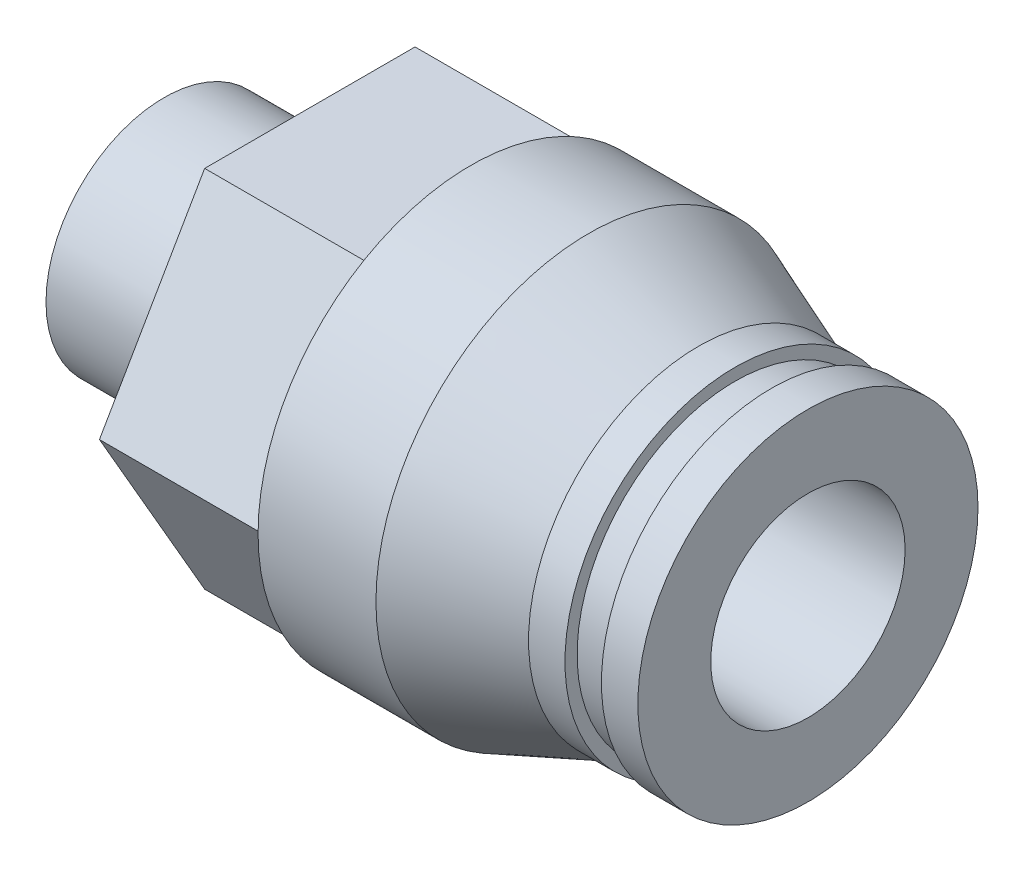
ISO-10303-21;
HEADER;
FILE_DESCRIPTION(('STEP AP214'),'2;1');
FILE_NAME('part.step','',(''),(''),'','','');
FILE_SCHEMA(('AUTOMOTIVE_DESIGN { 1 0 10303 214 1 1 1 1 }'));
ENDSEC;
DATA;
#1=APPLICATION_CONTEXT('core data for automotive mechanical design processes');
#2=APPLICATION_PROTOCOL_DEFINITION('international standard','automotive_design',2000,#1);
#3=PRODUCT_CONTEXT('',#1,'mechanical');
#4=PRODUCT('Part','Part','',(#3));
#5=PRODUCT_RELATED_PRODUCT_CATEGORY('part','',(#4));
#6=PRODUCT_DEFINITION_FORMATION('','',#4);
#7=PRODUCT_DEFINITION_CONTEXT('part definition',#1,'design');
#8=PRODUCT_DEFINITION('design','',#6,#7);
#9=PRODUCT_DEFINITION_SHAPE('','',#8);
#10=(LENGTH_UNIT() NAMED_UNIT(*) SI_UNIT(.MILLI.,.METRE.));
#11=(NAMED_UNIT(*) PLANE_ANGLE_UNIT() SI_UNIT($,.RADIAN.));
#12=(NAMED_UNIT(*) SI_UNIT($,.STERADIAN.) SOLID_ANGLE_UNIT());
#13=UNCERTAINTY_MEASURE_WITH_UNIT(LENGTH_MEASURE(1.E-05),#10,'distance_accuracy_value','');
#14=(GEOMETRIC_REPRESENTATION_CONTEXT(3) GLOBAL_UNCERTAINTY_ASSIGNED_CONTEXT((#13)) GLOBAL_UNIT_ASSIGNED_CONTEXT((#10,
#11,#12)) REPRESENTATION_CONTEXT('',''));
#15=CARTESIAN_POINT('',(0.,0.,0.));
#16=DIRECTION('',(0.,0.,1.));
#17=DIRECTION('',(1.,0.,0.));
#18=AXIS2_PLACEMENT_3D('',#15,#16,#17);
#19=CARTESIAN_POINT('',(6.,4.86,0.));
#20=DIRECTION('',(-1.,0.,0.));
#21=DIRECTION('',(0.,0.,1.));
#22=AXIS2_PLACEMENT_3D('',#19,#20,#21);
#23=PLANE('',#22);
#24=CARTESIAN_POINT('',(6.,0.,0.));
#25=DIRECTION('',(1.,0.,0.));
#26=DIRECTION('',(0.,0.,-1.));
#27=AXIS2_PLACEMENT_3D('',#24,#25,#26);
#28=CIRCLE('',#27,4.86);
#29=CARTESIAN_POINT('',(6.,0.,-4.86));
#30=VERTEX_POINT('',#29);
#31=EDGE_CURVE('E219',#30,#30,#28,.T.);
#32=ORIENTED_EDGE('',*,*,#31,.T.);
#33=EDGE_LOOP('',(#32));
#34=FACE_BOUND('',#33,.T.);
#35=DIRECTION('',(0.,-0.866025403784439,0.5));
#36=VECTOR('',#35,1.);
#37=CARTESIAN_POINT('',(6.,0.,-8.66025403784439));
#38=LINE('',#37,#36);
#39=CARTESIAN_POINT('',(6.,0.,-8.66025403784439));
#40=VERTEX_POINT('',#39);
#41=CARTESIAN_POINT('',(6.,-7.5,-4.33012701892219));
#42=VERTEX_POINT('',#41);
#43=EDGE_CURVE('E128',#40,#42,#38,.T.);
#44=ORIENTED_EDGE('',*,*,#43,.T.);
#45=DIRECTION('',(0.,0.,1.));
#46=VECTOR('',#45,1.);
#47=CARTESIAN_POINT('',(6.,-7.5,-4.33012701892219));
#48=LINE('',#47,#46);
#49=CARTESIAN_POINT('',(6.,-7.5,4.3301270189222));
#50=VERTEX_POINT('',#49);
#51=EDGE_CURVE('E111',#42,#50,#48,.T.);
#52=ORIENTED_EDGE('',*,*,#51,.T.);
#53=DIRECTION('',(0.,0.866025403784439,0.5));
#54=VECTOR('',#53,1.);
#55=CARTESIAN_POINT('',(6.,-7.5,4.3301270189222));
#56=LINE('',#55,#54);
#57=CARTESIAN_POINT('',(6.,0.,8.66025403784439));
#58=VERTEX_POINT('',#57);
#59=EDGE_CURVE('E122',#50,#58,#56,.T.);
#60=ORIENTED_EDGE('',*,*,#59,.T.);
#61=DIRECTION('',(0.,0.866025403784439,-0.5));
#62=VECTOR('',#61,1.);
#63=CARTESIAN_POINT('',(6.,0.,8.66025403784439));
#64=LINE('',#63,#62);
#65=CARTESIAN_POINT('',(6.,7.5,4.33012701892219));
#66=VERTEX_POINT('',#65);
#67=EDGE_CURVE('E31',#58,#66,#64,.T.);
#68=ORIENTED_EDGE('',*,*,#67,.T.);
#69=DIRECTION('',(0.,0.,-1.));
#70=VECTOR('',#69,1.);
#71=CARTESIAN_POINT('',(6.,7.5,4.33012701892219));
#72=LINE('',#71,#70);
#73=CARTESIAN_POINT('',(6.,7.5,-4.3301270189222));
#74=VERTEX_POINT('',#73);
#75=EDGE_CURVE('E132',#66,#74,#72,.T.);
#76=ORIENTED_EDGE('',*,*,#75,.T.);
#77=DIRECTION('',(0.,-0.866025403784439,-0.5));
#78=VECTOR('',#77,1.);
#79=CARTESIAN_POINT('',(6.,7.5,-4.3301270189222));
#80=LINE('',#79,#78);
#81=EDGE_CURVE('E135',#74,#40,#80,.T.);
#82=ORIENTED_EDGE('',*,*,#81,.T.);
#83=EDGE_LOOP('',(#44,#52,#60,#68,#76,#82));
#84=FACE_BOUND('',#83,.T.);
#85=ADVANCED_FACE('F16',(#34,#84),#23,.T.);
#86=CARTESIAN_POINT('',(0.,0.,0.));
#87=DIRECTION('',(-1.,0.,0.));
#88=DIRECTION('',(0.,0.,1.));
#89=AXIS2_PLACEMENT_3D('',#86,#87,#88);
#90=PLANE('',#89);
#91=CARTESIAN_POINT('',(0.,0.,0.));
#92=DIRECTION('',(1.,0.,0.));
#93=DIRECTION('',(0.,0.,-1.));
#94=AXIS2_PLACEMENT_3D('',#91,#92,#93);
#95=CIRCLE('',#94,4.86);
#96=CARTESIAN_POINT('',(0.,0.,-4.86));
#97=VERTEX_POINT('',#96);
#98=EDGE_CURVE('E222',#97,#97,#95,.T.);
#99=ORIENTED_EDGE('',*,*,#98,.F.);
#100=EDGE_LOOP('',(#99));
#101=FACE_BOUND('',#100,.T.);
#102=DIRECTION('',(0.,-0.866025403784439,-0.5));
#103=VECTOR('',#102,1.);
#104=CARTESIAN_POINT('',(0.,0.,2.88675134594813));
#105=LINE('',#104,#103);
#106=CARTESIAN_POINT('',(0.,0.,2.88675134594813));
#107=VERTEX_POINT('',#106);
#108=CARTESIAN_POINT('',(0.,-2.5,1.44337567297406));
#109=VERTEX_POINT('',#108);
#110=EDGE_CURVE('E177',#107,#109,#105,.T.);
#111=ORIENTED_EDGE('',*,*,#110,.T.);
#112=DIRECTION('',(0.,0.,-1.));
#113=VECTOR('',#112,1.);
#114=CARTESIAN_POINT('',(0.,-2.5,1.44337567297406));
#115=LINE('',#114,#113);
#116=CARTESIAN_POINT('',(0.,-2.5,-1.44337567297407));
#117=VERTEX_POINT('',#116);
#118=EDGE_CURVE('E39',#109,#117,#115,.T.);
#119=ORIENTED_EDGE('',*,*,#118,.T.);
#120=DIRECTION('',(0.,0.866025403784439,-0.5));
#121=VECTOR('',#120,1.);
#122=CARTESIAN_POINT('',(0.,-2.5,-1.44337567297407));
#123=LINE('',#122,#121);
#124=CARTESIAN_POINT('',(0.,0.,-2.88675134594813));
#125=VERTEX_POINT('',#124);
#126=EDGE_CURVE('E165',#117,#125,#123,.T.);
#127=ORIENTED_EDGE('',*,*,#126,.T.);
#128=DIRECTION('',(0.,0.866025403784439,0.5));
#129=VECTOR('',#128,1.);
#130=CARTESIAN_POINT('',(0.,0.,-2.88675134594813));
#131=LINE('',#130,#129);
#132=CARTESIAN_POINT('',(0.,2.5,-1.44337567297407));
#133=VERTEX_POINT('',#132);
#134=EDGE_CURVE('E168',#125,#133,#131,.T.);
#135=ORIENTED_EDGE('',*,*,#134,.T.);
#136=DIRECTION('',(0.,0.,1.));
#137=VECTOR('',#136,1.);
#138=CARTESIAN_POINT('',(0.,2.5,-1.44337567297407));
#139=LINE('',#138,#137);
#140=CARTESIAN_POINT('',(0.,2.5,1.44337567297406));
#141=VERTEX_POINT('',#140);
#142=EDGE_CURVE('E171',#133,#141,#139,.T.);
#143=ORIENTED_EDGE('',*,*,#142,.T.);
#144=DIRECTION('',(0.,-0.866025403784439,0.5));
#145=VECTOR('',#144,1.);
#146=CARTESIAN_POINT('',(0.,2.5,1.44337567297406));
#147=LINE('',#146,#145);
#148=EDGE_CURVE('E174',#141,#107,#147,.T.);
#149=ORIENTED_EDGE('',*,*,#148,.T.);
#150=EDGE_LOOP('',(#111,#119,#127,#135,#143,#149));
#151=FACE_BOUND('',#150,.T.);
#152=ADVANCED_FACE('F18',(#101,#151),#90,.T.);
#153=CARTESIAN_POINT('',(9.,4.,0.));
#154=DIRECTION('',(1.,0.,0.));
#155=DIRECTION('',(0.,0.,-1.));
#156=AXIS2_PLACEMENT_3D('',#153,#154,#155);
#157=PLANE('',#156);
#158=CARTESIAN_POINT('',(9.,0.,0.));
#159=DIRECTION('',(1.,0.,0.));
#160=DIRECTION('',(0.,0.,-1.));
#161=AXIS2_PLACEMENT_3D('',#158,#159,#160);
#162=CIRCLE('',#161,4.);
#163=CARTESIAN_POINT('',(9.,0.,-4.));
#164=VERTEX_POINT('',#163);
#165=EDGE_CURVE('E192',#164,#164,#162,.T.);
#166=ORIENTED_EDGE('',*,*,#165,.T.);
#167=EDGE_LOOP('',(#166));
#168=FACE_BOUND('',#167,.T.);
#169=DIRECTION('',(0.,-0.866025403784439,0.5));
#170=VECTOR('',#169,1.);
#171=CARTESIAN_POINT('',(9.,1.75,-3.89711431702998));
#172=LINE('',#171,#170);
#173=CARTESIAN_POINT('',(9.,0.,-2.88675134594813));
#174=VERTEX_POINT('',#173);
#175=CARTESIAN_POINT('',(9.,-2.5,-1.44337567297407));
#176=VERTEX_POINT('',#175);
#177=EDGE_CURVE('E24',#174,#176,#172,.T.);
#178=ORIENTED_EDGE('',*,*,#177,.T.);
#179=DIRECTION('',(0.,0.,1.));
#180=VECTOR('',#179,1.);
#181=CARTESIAN_POINT('',(9.,-2.5,0.));
#182=LINE('',#181,#180);
#183=CARTESIAN_POINT('',(9.,-2.5,1.44337567297406));
#184=VERTEX_POINT('',#183);
#185=EDGE_CURVE('E10',#176,#184,#182,.T.);
#186=ORIENTED_EDGE('',*,*,#185,.T.);
#187=DIRECTION('',(0.,0.866025403784439,0.5));
#188=VECTOR('',#187,1.);
#189=CARTESIAN_POINT('',(9.,1.75,3.89711431702997));
#190=LINE('',#189,#188);
#191=CARTESIAN_POINT('',(9.,0.,2.88675134594813));
#192=VERTEX_POINT('',#191);
#193=EDGE_CURVE('E225',#184,#192,#190,.T.);
#194=ORIENTED_EDGE('',*,*,#193,.T.);
#195=DIRECTION('',(0.,0.866025403784439,-0.5));
#196=VECTOR('',#195,1.);
#197=CARTESIAN_POINT('',(9.,4.25,0.433012701892217));
#198=LINE('',#197,#196);
#199=CARTESIAN_POINT('',(9.,2.5,1.44337567297406));
#200=VERTEX_POINT('',#199);
#201=EDGE_CURVE('E228',#192,#200,#198,.T.);
#202=ORIENTED_EDGE('',*,*,#201,.T.);
#203=DIRECTION('',(0.,0.,-1.));
#204=VECTOR('',#203,1.);
#205=CARTESIAN_POINT('',(9.,2.5,0.));
#206=LINE('',#205,#204);
#207=CARTESIAN_POINT('',(9.,2.5,-1.44337567297407));
#208=VERTEX_POINT('',#207);
#209=EDGE_CURVE('E231',#200,#208,#206,.T.);
#210=ORIENTED_EDGE('',*,*,#209,.T.);
#211=DIRECTION('',(0.,-0.866025403784439,-0.5));
#212=VECTOR('',#211,1.);
#213=CARTESIAN_POINT('',(9.,4.25,-0.433012701892219));
#214=LINE('',#213,#212);
#215=EDGE_CURVE('E234',#208,#174,#214,.T.);
#216=ORIENTED_EDGE('',*,*,#215,.T.);
#217=EDGE_LOOP('',(#178,#186,#194,#202,#210,#216));
#218=FACE_BOUND('',#217,.T.);
#219=ADVANCED_FACE('F238',(#168,#218),#157,.T.);
#220=CARTESIAN_POINT('',(0.,0.,0.));
#221=DIRECTION('',(1.,0.,0.));
#222=DIRECTION('',(0.,0.,-1.));
#223=AXIS2_PLACEMENT_3D('',#220,#221,#222);
#224=CYLINDRICAL_SURFACE('',#223,4.86);
#225=ORIENTED_EDGE('',*,*,#98,.T.);
#226=EDGE_LOOP('',(#225));
#227=FACE_BOUND('',#226,.T.);
#228=ORIENTED_EDGE('',*,*,#31,.F.);
#229=EDGE_LOOP('',(#228));
#230=FACE_BOUND('',#229,.T.);
#231=ADVANCED_FACE('F279',(#227,#230),#224,.T.);
#232=CARTESIAN_POINT('',(0.,0.,0.));
#233=DIRECTION('',(1.,0.,0.));
#234=DIRECTION('',(0.,0.,-1.));
#235=AXIS2_PLACEMENT_3D('',#232,#233,#234);
#236=CYLINDRICAL_SURFACE('',#235,8.75688111520238);
#237=CARTESIAN_POINT('',(12.625,0.,0.));
#238=DIRECTION('',(-1.,0.,0.));
#239=DIRECTION('',(0.,0.,1.));
#240=AXIS2_PLACEMENT_3D('',#237,#238,#239);
#241=CIRCLE('',#240,8.75688111520238);
#242=CARTESIAN_POINT('',(12.625,0.,8.75688111520238));
#243=VERTEX_POINT('',#242);
#244=EDGE_CURVE('E154',#243,#243,#241,.F.);
#245=ORIENTED_EDGE('',*,*,#244,.T.);
#246=EDGE_LOOP('',(#245));
#247=FACE_BOUND('',#246,.T.);
#248=CARTESIAN_POINT('',(17.4771203334909,0.,0.));
#249=DIRECTION('',(1.,0.,0.));
#250=DIRECTION('',(0.,0.,-1.));
#251=AXIS2_PLACEMENT_3D('',#248,#249,#250);
#252=CIRCLE('',#251,8.75688111520238);
#253=CARTESIAN_POINT('',(17.4771203334909,0.,-8.75688111520238));
#254=VERTEX_POINT('',#253);
#255=EDGE_CURVE('E216',#254,#254,#252,.T.);
#256=ORIENTED_EDGE('',*,*,#255,.F.);
#257=EDGE_LOOP('',(#256));
#258=FACE_BOUND('',#257,.T.);
#259=ADVANCED_FACE('F277',(#247,#258),#236,.T.);
#260=CARTESIAN_POINT('',(22.,0.,0.));
#261=DIRECTION('',(-1.,0.,0.));
#262=DIRECTION('',(0.,0.,1.));
#263=AXIS2_PLACEMENT_3D('',#260,#261,#262);
#264=CONICAL_SURFACE('',#263,7.,0.370503949260779);
#265=ORIENTED_EDGE('',*,*,#255,.T.);
#266=EDGE_LOOP('',(#265));
#267=FACE_BOUND('',#266,.T.);
#268=CARTESIAN_POINT('',(22.,0.,0.));
#269=DIRECTION('',(1.,0.,0.));
#270=DIRECTION('',(0.,0.,-1.));
#271=AXIS2_PLACEMENT_3D('',#268,#269,#270);
#272=CIRCLE('',#271,7.);
#273=CARTESIAN_POINT('',(22.,0.,-7.));
#274=VERTEX_POINT('',#273);
#275=EDGE_CURVE('E213',#274,#274,#272,.T.);
#276=ORIENTED_EDGE('',*,*,#275,.F.);
#277=EDGE_LOOP('',(#276));
#278=FACE_BOUND('',#277,.T.);
#279=ADVANCED_FACE('F286',(#267,#278),#264,.T.);
#280=CARTESIAN_POINT('',(0.,0.,0.));
#281=DIRECTION('',(1.,0.,0.));
#282=DIRECTION('',(0.,0.,-1.));
#283=AXIS2_PLACEMENT_3D('',#280,#281,#282);
#284=CYLINDRICAL_SURFACE('',#283,7.);
#285=ORIENTED_EDGE('',*,*,#275,.T.);
#286=EDGE_LOOP('',(#285));
#287=FACE_BOUND('',#286,.T.);
#288=CARTESIAN_POINT('',(23.5,0.,0.));
#289=DIRECTION('',(1.,0.,0.));
#290=DIRECTION('',(0.,0.,-1.));
#291=AXIS2_PLACEMENT_3D('',#288,#289,#290);
#292=CIRCLE('',#291,7.);
#293=CARTESIAN_POINT('',(23.5,0.,-7.));
#294=VERTEX_POINT('',#293);
#295=EDGE_CURVE('E210',#294,#294,#292,.T.);
#296=ORIENTED_EDGE('',*,*,#295,.F.);
#297=EDGE_LOOP('',(#296));
#298=FACE_BOUND('',#297,.T.);
#299=ADVANCED_FACE('F313',(#287,#298),#284,.T.);
#300=CARTESIAN_POINT('',(23.5,7.,0.));
#301=DIRECTION('',(1.,0.,0.));
#302=DIRECTION('',(0.,0.,-1.));
#303=AXIS2_PLACEMENT_3D('',#300,#301,#302);
#304=PLANE('',#303);
#305=ORIENTED_EDGE('',*,*,#295,.T.);
#306=EDGE_LOOP('',(#305));
#307=FACE_BOUND('',#306,.T.);
#308=CARTESIAN_POINT('',(23.5,0.,0.));
#309=DIRECTION('',(1.,0.,0.));
#310=DIRECTION('',(0.,0.,-1.));
#311=AXIS2_PLACEMENT_3D('',#308,#309,#310);
#312=CIRCLE('',#311,6.5);
#313=CARTESIAN_POINT('',(23.5,0.,-6.5));
#314=VERTEX_POINT('',#313);
#315=EDGE_CURVE('E207',#314,#314,#312,.T.);
#316=ORIENTED_EDGE('',*,*,#315,.F.);
#317=EDGE_LOOP('',(#316));
#318=FACE_BOUND('',#317,.T.);
#319=ADVANCED_FACE('F309',(#307,#318),#304,.T.);
#320=CARTESIAN_POINT('',(0.,0.,0.));
#321=DIRECTION('',(1.,0.,0.));
#322=DIRECTION('',(0.,0.,-1.));
#323=AXIS2_PLACEMENT_3D('',#320,#321,#322);
#324=CYLINDRICAL_SURFACE('',#323,6.5);
#325=ORIENTED_EDGE('',*,*,#315,.T.);
#326=EDGE_LOOP('',(#325));
#327=FACE_BOUND('',#326,.T.);
#328=CARTESIAN_POINT('',(25.,0.,0.));
#329=DIRECTION('',(1.,0.,0.));
#330=DIRECTION('',(0.,0.,-1.));
#331=AXIS2_PLACEMENT_3D('',#328,#329,#330);
#332=CIRCLE('',#331,6.5);
#333=CARTESIAN_POINT('',(25.,0.,-6.5));
#334=VERTEX_POINT('',#333);
#335=EDGE_CURVE('E204',#334,#334,#332,.T.);
#336=ORIENTED_EDGE('',*,*,#335,.F.);
#337=EDGE_LOOP('',(#336));
#338=FACE_BOUND('',#337,.T.);
#339=ADVANCED_FACE('F305',(#327,#338),#324,.T.);
#340=CARTESIAN_POINT('',(25.,6.5,0.));
#341=DIRECTION('',(-1.,0.,0.));
#342=DIRECTION('',(0.,0.,1.));
#343=AXIS2_PLACEMENT_3D('',#340,#341,#342);
#344=PLANE('',#343);
#345=ORIENTED_EDGE('',*,*,#335,.T.);
#346=EDGE_LOOP('',(#345));
#347=FACE_BOUND('',#346,.T.);
#348=CARTESIAN_POINT('',(25.,0.,0.));
#349=DIRECTION('',(1.,0.,0.));
#350=DIRECTION('',(0.,0.,-1.));
#351=AXIS2_PLACEMENT_3D('',#348,#349,#350);
#352=CIRCLE('',#351,7.);
#353=CARTESIAN_POINT('',(25.,0.,-7.));
#354=VERTEX_POINT('',#353);
#355=EDGE_CURVE('E201',#354,#354,#352,.T.);
#356=ORIENTED_EDGE('',*,*,#355,.F.);
#357=EDGE_LOOP('',(#356));
#358=FACE_BOUND('',#357,.T.);
#359=ADVANCED_FACE('F301',(#347,#358),#344,.T.);
#360=CARTESIAN_POINT('',(0.,0.,0.));
#361=DIRECTION('',(1.,0.,0.));
#362=DIRECTION('',(0.,0.,-1.));
#363=AXIS2_PLACEMENT_3D('',#360,#361,#362);
#364=CYLINDRICAL_SURFACE('',#363,7.);
#365=ORIENTED_EDGE('',*,*,#355,.T.);
#366=EDGE_LOOP('',(#365));
#367=FACE_BOUND('',#366,.T.);
#368=CARTESIAN_POINT('',(26.5,0.,0.));
#369=DIRECTION('',(1.,0.,0.));
#370=DIRECTION('',(0.,0.,-1.));
#371=AXIS2_PLACEMENT_3D('',#368,#369,#370);
#372=CIRCLE('',#371,7.);
#373=CARTESIAN_POINT('',(26.5,0.,-7.));
#374=VERTEX_POINT('',#373);
#375=EDGE_CURVE('E198',#374,#374,#372,.T.);
#376=ORIENTED_EDGE('',*,*,#375,.F.);
#377=EDGE_LOOP('',(#376));
#378=FACE_BOUND('',#377,.T.);
#379=ADVANCED_FACE('F297',(#367,#378),#364,.T.);
#380=CARTESIAN_POINT('',(26.5,7.,0.));
#381=DIRECTION('',(1.,0.,0.));
#382=DIRECTION('',(0.,0.,-1.));
#383=AXIS2_PLACEMENT_3D('',#380,#381,#382);
#384=PLANE('',#383);
#385=ORIENTED_EDGE('',*,*,#375,.T.);
#386=EDGE_LOOP('',(#385));
#387=FACE_BOUND('',#386,.T.);
#388=CARTESIAN_POINT('',(26.5,0.,0.));
#389=DIRECTION('',(1.,0.,0.));
#390=DIRECTION('',(0.,0.,-1.));
#391=AXIS2_PLACEMENT_3D('',#388,#389,#390);
#392=CIRCLE('',#391,4.);
#393=CARTESIAN_POINT('',(26.5,0.,-4.));
#394=VERTEX_POINT('',#393);
#395=EDGE_CURVE('E195',#394,#394,#392,.T.);
#396=ORIENTED_EDGE('',*,*,#395,.F.);
#397=EDGE_LOOP('',(#396));
#398=FACE_BOUND('',#397,.T.);
#399=ADVANCED_FACE('F265',(#387,#398),#384,.T.);
#400=CARTESIAN_POINT('',(0.,0.,0.));
#401=DIRECTION('',(1.,0.,0.));
#402=DIRECTION('',(0.,0.,-1.));
#403=AXIS2_PLACEMENT_3D('',#400,#401,#402);
#404=CYLINDRICAL_SURFACE('',#403,4.);
#405=ORIENTED_EDGE('',*,*,#395,.T.);
#406=EDGE_LOOP('',(#405));
#407=FACE_BOUND('',#406,.T.);
#408=ORIENTED_EDGE('',*,*,#165,.F.);
#409=EDGE_LOOP('',(#408));
#410=FACE_BOUND('',#409,.T.);
#411=ADVANCED_FACE('F257',(#407,#410),#404,.F.);
#412=CARTESIAN_POINT('',(26.5,-2.5,1.44337567297406));
#413=DIRECTION('',(0.,1.,0.));
#414=DIRECTION('',(0.,0.,1.));
#415=AXIS2_PLACEMENT_3D('',#412,#413,#414);
#416=PLANE('',#415);
#417=DIRECTION('',(-1.,0.,0.));
#418=VECTOR('',#417,1.);
#419=CARTESIAN_POINT('',(26.5,-2.5,-1.44337567297407));
#420=LINE('',#419,#418);
#421=EDGE_CURVE('E190',#176,#117,#420,.T.);
#422=ORIENTED_EDGE('',*,*,#421,.T.);
#423=ORIENTED_EDGE('',*,*,#118,.F.);
#424=DIRECTION('',(-1.,0.,0.));
#425=VECTOR('',#424,1.);
#426=CARTESIAN_POINT('',(26.5,-2.5,1.44337567297406));
#427=LINE('',#426,#425);
#428=EDGE_CURVE('E180',#184,#109,#427,.T.);
#429=ORIENTED_EDGE('',*,*,#428,.F.);
#430=ORIENTED_EDGE('',*,*,#185,.F.);
#431=EDGE_LOOP('',(#422,#423,#429,#430));
#432=FACE_BOUND('',#431,.T.);
#433=ADVANCED_FACE('F255',(#432),#416,.T.);
#434=CARTESIAN_POINT('',(26.5,-2.5,-1.44337567297407));
#435=DIRECTION('',(0.,0.5,0.866025403784439));
#436=DIRECTION('',(0.,-0.866025403784439,0.5));
#437=AXIS2_PLACEMENT_3D('',#434,#435,#436);
#438=PLANE('',#437);
#439=DIRECTION('',(-1.,0.,0.));
#440=VECTOR('',#439,1.);
#441=CARTESIAN_POINT('',(26.5,0.,-2.88675134594813));
#442=LINE('',#441,#440);
#443=EDGE_CURVE('E188',#174,#125,#442,.T.);
#444=ORIENTED_EDGE('',*,*,#443,.T.);
#445=ORIENTED_EDGE('',*,*,#126,.F.);
#446=ORIENTED_EDGE('',*,*,#421,.F.);
#447=ORIENTED_EDGE('',*,*,#177,.F.);
#448=EDGE_LOOP('',(#444,#445,#446,#447));
#449=FACE_BOUND('',#448,.T.);
#450=ADVANCED_FACE('F242',(#449),#438,.T.);
#451=CARTESIAN_POINT('',(26.5,0.,-2.88675134594813));
#452=DIRECTION('',(0.,-0.5,0.866025403784438));
#453=DIRECTION('',(0.,-0.866025403784439,-0.5));
#454=AXIS2_PLACEMENT_3D('',#451,#452,#453);
#455=PLANE('',#454);
#456=DIRECTION('',(-1.,0.,0.));
#457=VECTOR('',#456,1.);
#458=CARTESIAN_POINT('',(26.5,2.5,-1.44337567297407));
#459=LINE('',#458,#457);
#460=EDGE_CURVE('E186',#208,#133,#459,.T.);
#461=ORIENTED_EDGE('',*,*,#460,.T.);
#462=ORIENTED_EDGE('',*,*,#134,.F.);
#463=ORIENTED_EDGE('',*,*,#443,.F.);
#464=ORIENTED_EDGE('',*,*,#215,.F.);
#465=EDGE_LOOP('',(#461,#462,#463,#464));
#466=FACE_BOUND('',#465,.T.);
#467=ADVANCED_FACE('F246',(#466),#455,.T.);
#468=CARTESIAN_POINT('',(26.5,2.5,-1.44337567297407));
#469=DIRECTION('',(0.,-1.,0.));
#470=DIRECTION('',(0.,0.,-1.));
#471=AXIS2_PLACEMENT_3D('',#468,#469,#470);
#472=PLANE('',#471);
#473=DIRECTION('',(-1.,0.,0.));
#474=VECTOR('',#473,1.);
#475=CARTESIAN_POINT('',(26.5,2.5,1.44337567297406));
#476=LINE('',#475,#474);
#477=EDGE_CURVE('E184',#200,#141,#476,.T.);
#478=ORIENTED_EDGE('',*,*,#477,.T.);
#479=ORIENTED_EDGE('',*,*,#142,.F.);
#480=ORIENTED_EDGE('',*,*,#460,.F.);
#481=ORIENTED_EDGE('',*,*,#209,.F.);
#482=EDGE_LOOP('',(#478,#479,#480,#481));
#483=FACE_BOUND('',#482,.T.);
#484=ADVANCED_FACE('F402',(#483),#472,.T.);
#485=CARTESIAN_POINT('',(26.5,2.5,1.44337567297406));
#486=DIRECTION('',(0.,-0.5,-0.866025403784438));
#487=DIRECTION('',(0.,0.866025403784439,-0.5));
#488=AXIS2_PLACEMENT_3D('',#485,#486,#487);
#489=PLANE('',#488);
#490=DIRECTION('',(-1.,0.,0.));
#491=VECTOR('',#490,1.);
#492=CARTESIAN_POINT('',(26.5,0.,2.88675134594813));
#493=LINE('',#492,#491);
#494=EDGE_CURVE('E182',#192,#107,#493,.T.);
#495=ORIENTED_EDGE('',*,*,#494,.T.);
#496=ORIENTED_EDGE('',*,*,#148,.F.);
#497=ORIENTED_EDGE('',*,*,#477,.F.);
#498=ORIENTED_EDGE('',*,*,#201,.F.);
#499=EDGE_LOOP('',(#495,#496,#497,#498));
#500=FACE_BOUND('',#499,.T.);
#501=ADVANCED_FACE('F411',(#500),#489,.T.);
#502=CARTESIAN_POINT('',(26.5,0.,2.88675134594813));
#503=DIRECTION('',(0.,0.5,-0.866025403784438));
#504=DIRECTION('',(0.,0.866025403784439,0.5));
#505=AXIS2_PLACEMENT_3D('',#502,#503,#504);
#506=PLANE('',#505);
#507=ORIENTED_EDGE('',*,*,#428,.T.);
#508=ORIENTED_EDGE('',*,*,#110,.F.);
#509=ORIENTED_EDGE('',*,*,#494,.F.);
#510=ORIENTED_EDGE('',*,*,#193,.F.);
#511=EDGE_LOOP('',(#507,#508,#509,#510));
#512=FACE_BOUND('',#511,.T.);
#513=ADVANCED_FACE('F253',(#512),#506,.T.);
#514=CARTESIAN_POINT('',(12.625,0.,0.));
#515=DIRECTION('',(-1.,0.,0.));
#516=DIRECTION('',(0.,0.,1.));
#517=AXIS2_PLACEMENT_3D('',#514,#515,#516);
#518=PLANE('',#517);
#519=ORIENTED_EDGE('',*,*,#244,.F.);
#520=EDGE_LOOP('',(#519));
#521=FACE_BOUND('',#520,.T.);
#522=DIRECTION('',(0.,-0.866025403784439,0.5));
#523=VECTOR('',#522,1.);
#524=CARTESIAN_POINT('',(12.625,0.,-8.66025403784439));
#525=LINE('',#524,#523);
#526=CARTESIAN_POINT('',(12.625,0.,-8.66025403784439));
#527=VERTEX_POINT('',#526);
#528=CARTESIAN_POINT('',(12.625,-7.5,-4.33012701892219));
#529=VERTEX_POINT('',#528);
#530=EDGE_CURVE('E119',#527,#529,#525,.T.);
#531=ORIENTED_EDGE('',*,*,#530,.F.);
#532=DIRECTION('',(0.,-0.866025403784439,-0.5));
#533=VECTOR('',#532,1.);
#534=CARTESIAN_POINT('',(12.625,7.5,-4.3301270189222));
#535=LINE('',#534,#533);
#536=CARTESIAN_POINT('',(12.625,7.5,-4.3301270189222));
#537=VERTEX_POINT('',#536);
#538=EDGE_CURVE('E147',#537,#527,#535,.T.);
#539=ORIENTED_EDGE('',*,*,#538,.F.);
#540=DIRECTION('',(0.,0.,-1.));
#541=VECTOR('',#540,1.);
#542=CARTESIAN_POINT('',(12.625,7.5,4.33012701892219));
#543=LINE('',#542,#541);
#544=CARTESIAN_POINT('',(12.625,7.5,4.33012701892219));
#545=VERTEX_POINT('',#544);
#546=EDGE_CURVE('E144',#545,#537,#543,.T.);
#547=ORIENTED_EDGE('',*,*,#546,.F.);
#548=DIRECTION('',(0.,0.866025403784439,-0.5));
#549=VECTOR('',#548,1.);
#550=CARTESIAN_POINT('',(12.625,0.,8.66025403784439));
#551=LINE('',#550,#549);
#552=CARTESIAN_POINT('',(12.625,0.,8.66025403784439));
#553=VERTEX_POINT('',#552);
#554=EDGE_CURVE('E141',#553,#545,#551,.T.);
#555=ORIENTED_EDGE('',*,*,#554,.F.);
#556=DIRECTION('',(0.,0.866025403784439,0.5));
#557=VECTOR('',#556,1.);
#558=CARTESIAN_POINT('',(12.625,-7.5,4.3301270189222));
#559=LINE('',#558,#557);
#560=CARTESIAN_POINT('',(12.625,-7.5,4.3301270189222));
#561=VERTEX_POINT('',#560);
#562=EDGE_CURVE('E139',#561,#553,#559,.T.);
#563=ORIENTED_EDGE('',*,*,#562,.F.);
#564=DIRECTION('',(0.,0.,1.));
#565=VECTOR('',#564,1.);
#566=CARTESIAN_POINT('',(12.625,-7.5,-4.33012701892219));
#567=LINE('',#566,#565);
#568=EDGE_CURVE('E114',#529,#561,#567,.T.);
#569=ORIENTED_EDGE('',*,*,#568,.F.);
#570=EDGE_LOOP('',(#531,#539,#547,#555,#563,#569));
#571=FACE_BOUND('',#570,.T.);
#572=ADVANCED_FACE('F430',(#521,#571),#518,.T.);
#573=CARTESIAN_POINT('',(12.625,-7.5,-4.33012701892219));
#574=DIRECTION('',(0.,-1.,0.));
#575=DIRECTION('',(0.,0.,-1.));
#576=AXIS2_PLACEMENT_3D('',#573,#574,#575);
#577=PLANE('',#576);
#578=DIRECTION('',(-1.,0.,0.));
#579=VECTOR('',#578,1.);
#580=CARTESIAN_POINT('',(12.625,-7.5,-4.33012701892219));
#581=LINE('',#580,#579);
#582=EDGE_CURVE('E152',#529,#42,#581,.T.);
#583=ORIENTED_EDGE('',*,*,#582,.F.);
#584=ORIENTED_EDGE('',*,*,#568,.T.);
#585=DIRECTION('',(-1.,0.,0.));
#586=VECTOR('',#585,1.);
#587=CARTESIAN_POINT('',(12.625,-7.5,4.3301270189222));
#588=LINE('',#587,#586);
#589=EDGE_CURVE('E107',#561,#50,#588,.T.);
#590=ORIENTED_EDGE('',*,*,#589,.T.);
#591=ORIENTED_EDGE('',*,*,#51,.F.);
#592=EDGE_LOOP('',(#583,#584,#590,#591));
#593=FACE_BOUND('',#592,.T.);
#594=ADVANCED_FACE('F109',(#593),#577,.T.);
#595=CARTESIAN_POINT('',(12.625,0.,-8.66025403784439));
#596=DIRECTION('',(0.,-0.5,-0.866025403784439));
#597=DIRECTION('',(0.,0.866025403784439,-0.5));
#598=AXIS2_PLACEMENT_3D('',#595,#596,#597);
#599=PLANE('',#598);
#600=DIRECTION('',(-1.,0.,0.));
#601=VECTOR('',#600,1.);
#602=CARTESIAN_POINT('',(12.625,0.,-8.66025403784439));
#603=LINE('',#602,#601);
#604=EDGE_CURVE('E155',#527,#40,#603,.T.);
#605=ORIENTED_EDGE('',*,*,#604,.F.);
#606=ORIENTED_EDGE('',*,*,#530,.T.);
#607=ORIENTED_EDGE('',*,*,#582,.T.);
#608=ORIENTED_EDGE('',*,*,#43,.F.);
#609=EDGE_LOOP('',(#605,#606,#607,#608));
#610=FACE_BOUND('',#609,.T.);
#611=ADVANCED_FACE('F448',(#610),#599,.T.);
#612=CARTESIAN_POINT('',(12.625,7.5,-4.3301270189222));
#613=DIRECTION('',(0.,0.5,-0.866025403784439));
#614=DIRECTION('',(0.,0.866025403784439,0.5));
#615=AXIS2_PLACEMENT_3D('',#612,#613,#614);
#616=PLANE('',#615);
#617=DIRECTION('',(-1.,0.,0.));
#618=VECTOR('',#617,1.);
#619=CARTESIAN_POINT('',(12.625,7.5,-4.3301270189222));
#620=LINE('',#619,#618);
#621=EDGE_CURVE('E157',#537,#74,#620,.T.);
#622=ORIENTED_EDGE('',*,*,#621,.F.);
#623=ORIENTED_EDGE('',*,*,#538,.T.);
#624=ORIENTED_EDGE('',*,*,#604,.T.);
#625=ORIENTED_EDGE('',*,*,#81,.F.);
#626=EDGE_LOOP('',(#622,#623,#624,#625));
#627=FACE_BOUND('',#626,.T.);
#628=ADVANCED_FACE('F457',(#627),#616,.T.);
#629=CARTESIAN_POINT('',(12.625,7.5,4.33012701892219));
#630=DIRECTION('',(0.,1.,0.));
#631=DIRECTION('',(0.,0.,1.));
#632=AXIS2_PLACEMENT_3D('',#629,#630,#631);
#633=PLANE('',#632);
#634=DIRECTION('',(-1.,0.,0.));
#635=VECTOR('',#634,1.);
#636=CARTESIAN_POINT('',(12.625,7.5,4.33012701892219));
#637=LINE('',#636,#635);
#638=EDGE_CURVE('E159',#545,#66,#637,.T.);
#639=ORIENTED_EDGE('',*,*,#638,.F.);
#640=ORIENTED_EDGE('',*,*,#546,.T.);
#641=ORIENTED_EDGE('',*,*,#621,.T.);
#642=ORIENTED_EDGE('',*,*,#75,.F.);
#643=EDGE_LOOP('',(#639,#640,#641,#642));
#644=FACE_BOUND('',#643,.T.);
#645=ADVANCED_FACE('F467',(#644),#633,.T.);
#646=CARTESIAN_POINT('',(12.625,0.,8.66025403784439));
#647=DIRECTION('',(0.,0.5,0.866025403784439));
#648=DIRECTION('',(0.,-0.866025403784438,0.5));
#649=AXIS2_PLACEMENT_3D('',#646,#647,#648);
#650=PLANE('',#649);
#651=DIRECTION('',(-1.,0.,0.));
#652=VECTOR('',#651,1.);
#653=CARTESIAN_POINT('',(12.625,0.,8.66025403784439));
#654=LINE('',#653,#652);
#655=EDGE_CURVE('E118',#553,#58,#654,.T.);
#656=ORIENTED_EDGE('',*,*,#655,.F.);
#657=ORIENTED_EDGE('',*,*,#554,.T.);
#658=ORIENTED_EDGE('',*,*,#638,.T.);
#659=ORIENTED_EDGE('',*,*,#67,.F.);
#660=EDGE_LOOP('',(#656,#657,#658,#659));
#661=FACE_BOUND('',#660,.T.);
#662=ADVANCED_FACE('F477',(#661),#650,.T.);
#663=CARTESIAN_POINT('',(12.625,-7.5,4.3301270189222));
#664=DIRECTION('',(0.,-0.5,0.866025403784439));
#665=DIRECTION('',(0.,-0.866025403784439,-0.5));
#666=AXIS2_PLACEMENT_3D('',#663,#664,#665);
#667=PLANE('',#666);
#668=ORIENTED_EDGE('',*,*,#589,.F.);
#669=ORIENTED_EDGE('',*,*,#562,.T.);
#670=ORIENTED_EDGE('',*,*,#655,.T.);
#671=ORIENTED_EDGE('',*,*,#59,.F.);
#672=EDGE_LOOP('',(#668,#669,#670,#671));
#673=FACE_BOUND('',#672,.T.);
#674=ADVANCED_FACE('F123',(#673),#667,.T.);
#675=CLOSED_SHELL('',(#85,#152,#219,#231,#259,#279,#299,#319,#339,#359,#379,#399,#411,#433,#450,
#467,#484,#501,#513,#572,#594,#611,#628,#645,#662,#674));
#676=MANIFOLD_SOLID_BREP('B1',#675);
#677=ADVANCED_BREP_SHAPE_REPRESENTATION('',(#18,#676),#14);
#678=SHAPE_DEFINITION_REPRESENTATION(#9,#677);
ENDSEC;
END-ISO-10303-21;
